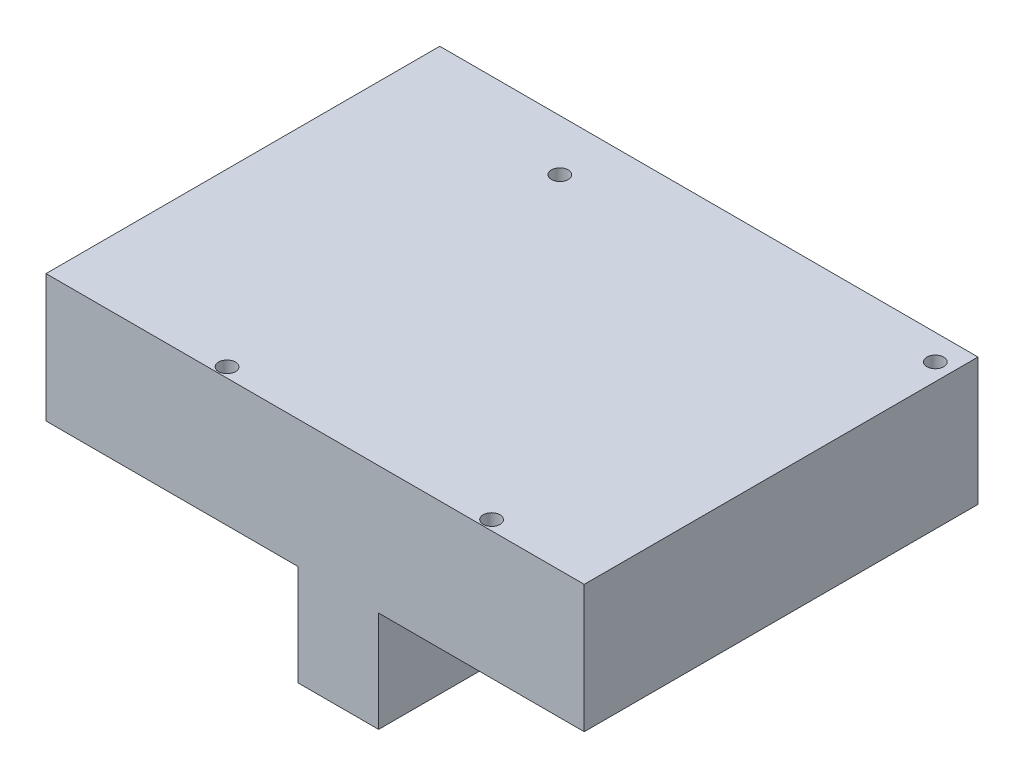
ISO-10303-21;
HEADER;
FILE_DESCRIPTION(('STEP AP214'),'2;1');
FILE_NAME('part.step','',(''),(''),'','','');
FILE_SCHEMA(('AUTOMOTIVE_DESIGN { 1 0 10303 214 1 1 1 1 }'));
ENDSEC;
DATA;
#1=APPLICATION_CONTEXT('core data for automotive mechanical design processes');
#2=APPLICATION_PROTOCOL_DEFINITION('international standard','automotive_design',2000,#1);
#3=PRODUCT_CONTEXT('',#1,'mechanical');
#4=PRODUCT('Part','Part','',(#3));
#5=PRODUCT_RELATED_PRODUCT_CATEGORY('part','',(#4));
#6=PRODUCT_DEFINITION_FORMATION('','',#4);
#7=PRODUCT_DEFINITION_CONTEXT('part definition',#1,'design');
#8=PRODUCT_DEFINITION('design','',#6,#7);
#9=PRODUCT_DEFINITION_SHAPE('','',#8);
#10=(LENGTH_UNIT() NAMED_UNIT(*) SI_UNIT(.MILLI.,.METRE.));
#11=(NAMED_UNIT(*) PLANE_ANGLE_UNIT() SI_UNIT($,.RADIAN.));
#12=(NAMED_UNIT(*) SI_UNIT($,.STERADIAN.) SOLID_ANGLE_UNIT());
#13=UNCERTAINTY_MEASURE_WITH_UNIT(LENGTH_MEASURE(1.E-05),#10,'distance_accuracy_value','');
#14=(GEOMETRIC_REPRESENTATION_CONTEXT(3) GLOBAL_UNCERTAINTY_ASSIGNED_CONTEXT((#13)) GLOBAL_UNIT_ASSIGNED_CONTEXT((#10,
#11,#12)) REPRESENTATION_CONTEXT('',''));
#15=CARTESIAN_POINT('',(0.,0.,0.));
#16=DIRECTION('',(0.,0.,1.));
#17=DIRECTION('',(1.,0.,0.));
#18=AXIS2_PLACEMENT_3D('',#15,#16,#17);
#19=CARTESIAN_POINT('',(0.,0.,0.));
#20=DIRECTION('',(0.,-1.,0.));
#21=DIRECTION('',(0.,0.,-1.));
#22=AXIS2_PLACEMENT_3D('',#19,#20,#21);
#23=PLANE('',#22);
#24=CARTESIAN_POINT('',(25.49,0.,-1.44999999999999));
#25=DIRECTION('',(0.,-1.,0.));
#26=DIRECTION('',(0.,0.,-1.));
#27=AXIS2_PLACEMENT_3D('',#24,#25,#26);
#28=CIRCLE('',#27,1.25000000000001);
#29=CARTESIAN_POINT('',(25.49,0.,-2.7));
#30=VERTEX_POINT('',#29);
#31=EDGE_CURVE('E168',#30,#30,#28,.T.);
#32=ORIENTED_EDGE('',*,*,#31,.F.);
#33=EDGE_LOOP('',(#32));
#34=FACE_BOUND('',#33,.T.);
#35=CARTESIAN_POINT('',(25.49,0.,-50.98));
#36=DIRECTION('',(0.,-1.,0.));
#37=DIRECTION('',(0.,0.,-1.));
#38=AXIS2_PLACEMENT_3D('',#35,#36,#37);
#39=CIRCLE('',#38,1.25000000000001);
#40=CARTESIAN_POINT('',(25.49,0.,-52.23));
#41=VERTEX_POINT('',#40);
#42=EDGE_CURVE('E162',#41,#41,#39,.T.);
#43=ORIENTED_EDGE('',*,*,#42,.F.);
#44=EDGE_LOOP('',(#43));
#45=FACE_BOUND('',#44,.T.);
#46=DIRECTION('',(0.,0.,-1.));
#47=VECTOR('',#46,1.);
#48=CARTESIAN_POINT('',(37.5,0.,-58.6));
#49=LINE('',#48,#47);
#50=CARTESIAN_POINT('',(37.5,0.,0.));
#51=VERTEX_POINT('',#50);
#52=CARTESIAN_POINT('',(37.5,0.,-58.6));
#53=VERTEX_POINT('',#52);
#54=EDGE_CURVE('E51',#51,#53,#49,.T.);
#55=ORIENTED_EDGE('',*,*,#54,.F.);
#56=DIRECTION('',(1.,0.,0.));
#57=VECTOR('',#56,1.);
#58=CARTESIAN_POINT('',(0.,0.,0.));
#59=LINE('',#58,#57);
#60=CARTESIAN_POINT('',(0.,0.,0.));
#61=VERTEX_POINT('',#60);
#62=EDGE_CURVE('E202',#61,#51,#59,.T.);
#63=ORIENTED_EDGE('',*,*,#62,.F.);
#64=DIRECTION('',(0.,0.,1.));
#65=VECTOR('',#64,1.);
#66=CARTESIAN_POINT('',(0.,0.,0.));
#67=LINE('',#66,#65);
#68=CARTESIAN_POINT('',(0.,0.,-58.6));
#69=VERTEX_POINT('',#68);
#70=EDGE_CURVE('E122',#69,#61,#67,.T.);
#71=ORIENTED_EDGE('',*,*,#70,.F.);
#72=DIRECTION('',(-1.,0.,0.));
#73=VECTOR('',#72,1.);
#74=CARTESIAN_POINT('',(0.,0.,-58.6));
#75=LINE('',#74,#73);
#76=EDGE_CURVE('E56',#53,#69,#75,.T.);
#77=ORIENTED_EDGE('',*,*,#76,.F.);
#78=EDGE_LOOP('',(#55,#63,#71,#77));
#79=FACE_BOUND('',#78,.T.);
#80=ADVANCED_FACE('F34',(#34,#45,#79),#23,.T.);
#81=CARTESIAN_POINT('',(0.,19.,0.));
#82=DIRECTION('',(1.,0.,0.));
#83=DIRECTION('',(0.,0.,-1.));
#84=AXIS2_PLACEMENT_3D('',#81,#82,#83);
#85=PLANE('',#84);
#86=ORIENTED_EDGE('',*,*,#70,.T.);
#87=DIRECTION('',(0.,-1.,0.));
#88=VECTOR('',#87,1.);
#89=CARTESIAN_POINT('',(0.,19.,0.));
#90=LINE('',#89,#88);
#91=CARTESIAN_POINT('',(0.,19.,0.));
#92=VERTEX_POINT('',#91);
#93=EDGE_CURVE('E11',#92,#61,#90,.T.);
#94=ORIENTED_EDGE('',*,*,#93,.F.);
#95=DIRECTION('',(0.,0.,1.));
#96=VECTOR('',#95,1.);
#97=CARTESIAN_POINT('',(0.,19.,0.));
#98=LINE('',#97,#96);
#99=CARTESIAN_POINT('',(0.,19.,-58.6));
#100=VERTEX_POINT('',#99);
#101=EDGE_CURVE('E145',#100,#92,#98,.T.);
#102=ORIENTED_EDGE('',*,*,#101,.F.);
#103=DIRECTION('',(0.,-1.,0.));
#104=VECTOR('',#103,1.);
#105=CARTESIAN_POINT('',(0.,19.,-58.6));
#106=LINE('',#105,#104);
#107=EDGE_CURVE('E213',#100,#69,#106,.T.);
#108=ORIENTED_EDGE('',*,*,#107,.T.);
#109=EDGE_LOOP('',(#86,#94,#102,#108));
#110=FACE_BOUND('',#109,.T.);
#111=ADVANCED_FACE('F36',(#110),#85,.F.);
#112=CARTESIAN_POINT('',(0.,19.,0.));
#113=DIRECTION('',(0.,0.,-1.));
#114=DIRECTION('',(-1.,0.,0.));
#115=AXIS2_PLACEMENT_3D('',#112,#113,#114);
#116=PLANE('',#115);
#117=ORIENTED_EDGE('',*,*,#62,.T.);
#118=DIRECTION('',(0.,1.,0.));
#119=VECTOR('',#118,1.);
#120=CARTESIAN_POINT('',(37.5,-15.,0.));
#121=LINE('',#120,#119);
#122=CARTESIAN_POINT('',(37.5,-15.,0.));
#123=VERTEX_POINT('',#122);
#124=EDGE_CURVE('E137',#123,#51,#121,.T.);
#125=ORIENTED_EDGE('',*,*,#124,.F.);
#126=DIRECTION('',(-1.,0.,0.));
#127=VECTOR('',#126,1.);
#128=CARTESIAN_POINT('',(37.5,-15.,0.));
#129=LINE('',#128,#127);
#130=CARTESIAN_POINT('',(49.5,-15.,0.));
#131=VERTEX_POINT('',#130);
#132=EDGE_CURVE('E115',#131,#123,#129,.T.);
#133=ORIENTED_EDGE('',*,*,#132,.F.);
#134=DIRECTION('',(0.,1.,0.));
#135=VECTOR('',#134,1.);
#136=CARTESIAN_POINT('',(49.5,-15.,0.));
#137=LINE('',#136,#135);
#138=CARTESIAN_POINT('',(49.5,0.,0.));
#139=VERTEX_POINT('',#138);
#140=EDGE_CURVE('E127',#131,#139,#137,.T.);
#141=ORIENTED_EDGE('',*,*,#140,.T.);
#142=CARTESIAN_POINT('',(80.1,0.,0.));
#143=VERTEX_POINT('',#142);
#144=EDGE_CURVE('E125',#139,#143,#59,.T.);
#145=ORIENTED_EDGE('',*,*,#144,.T.);
#146=DIRECTION('',(0.,-1.,0.));
#147=VECTOR('',#146,1.);
#148=CARTESIAN_POINT('',(80.1,19.,0.));
#149=LINE('',#148,#147);
#150=CARTESIAN_POINT('',(80.1,19.,0.));
#151=VERTEX_POINT('',#150);
#152=EDGE_CURVE('E43',#151,#143,#149,.T.);
#153=ORIENTED_EDGE('',*,*,#152,.F.);
#154=DIRECTION('',(1.,0.,0.));
#155=VECTOR('',#154,1.);
#156=CARTESIAN_POINT('',(0.,19.,0.));
#157=LINE('',#156,#155);
#158=EDGE_CURVE('E226',#92,#151,#157,.T.);
#159=ORIENTED_EDGE('',*,*,#158,.F.);
#160=ORIENTED_EDGE('',*,*,#93,.T.);
#161=EDGE_LOOP('',(#117,#125,#133,#141,#145,#153,#159,#160));
#162=FACE_BOUND('',#161,.T.);
#163=ADVANCED_FACE('F201',(#162),#116,.F.);
#164=CARTESIAN_POINT('',(80.1,19.,0.));
#165=DIRECTION('',(-1.,0.,0.));
#166=DIRECTION('',(0.,0.,1.));
#167=AXIS2_PLACEMENT_3D('',#164,#165,#166);
#168=PLANE('',#167);
#169=DIRECTION('',(0.,0.,-1.));
#170=VECTOR('',#169,1.);
#171=CARTESIAN_POINT('',(80.1,0.,0.));
#172=LINE('',#171,#170);
#173=CARTESIAN_POINT('',(80.1,0.,-58.6));
#174=VERTEX_POINT('',#173);
#175=EDGE_CURVE('E204',#143,#174,#172,.T.);
#176=ORIENTED_EDGE('',*,*,#175,.T.);
#177=DIRECTION('',(0.,-1.,0.));
#178=VECTOR('',#177,1.);
#179=CARTESIAN_POINT('',(80.1,19.,-58.6));
#180=LINE('',#179,#178);
#181=CARTESIAN_POINT('',(80.1,19.,-58.6));
#182=VERTEX_POINT('',#181);
#183=EDGE_CURVE('E198',#182,#174,#180,.T.);
#184=ORIENTED_EDGE('',*,*,#183,.F.);
#185=DIRECTION('',(0.,0.,-1.));
#186=VECTOR('',#185,1.);
#187=CARTESIAN_POINT('',(80.1,19.,0.));
#188=LINE('',#187,#186);
#189=EDGE_CURVE('E223',#151,#182,#188,.T.);
#190=ORIENTED_EDGE('',*,*,#189,.F.);
#191=ORIENTED_EDGE('',*,*,#152,.T.);
#192=EDGE_LOOP('',(#176,#184,#190,#191));
#193=FACE_BOUND('',#192,.T.);
#194=ADVANCED_FACE('F241',(#193),#168,.F.);
#195=CARTESIAN_POINT('',(0.,19.,-58.6));
#196=DIRECTION('',(0.,0.,1.));
#197=DIRECTION('',(1.,0.,0.));
#198=AXIS2_PLACEMENT_3D('',#195,#196,#197);
#199=PLANE('',#198);
#200=CARTESIAN_POINT('',(49.5,0.,-58.6));
#201=VERTEX_POINT('',#200);
#202=EDGE_CURVE('E193',#174,#201,#75,.T.);
#203=ORIENTED_EDGE('',*,*,#202,.T.);
#204=DIRECTION('',(0.,1.,0.));
#205=VECTOR('',#204,1.);
#206=CARTESIAN_POINT('',(49.5,-15.,-58.6));
#207=LINE('',#206,#205);
#208=CARTESIAN_POINT('',(49.5,-15.,-58.6));
#209=VERTEX_POINT('',#208);
#210=EDGE_CURVE('E106',#209,#201,#207,.T.);
#211=ORIENTED_EDGE('',*,*,#210,.F.);
#212=DIRECTION('',(1.,0.,0.));
#213=VECTOR('',#212,1.);
#214=CARTESIAN_POINT('',(37.5,-15.,-58.6));
#215=LINE('',#214,#213);
#216=CARTESIAN_POINT('',(37.5,-15.,-58.6));
#217=VERTEX_POINT('',#216);
#218=EDGE_CURVE('E99',#217,#209,#215,.T.);
#219=ORIENTED_EDGE('',*,*,#218,.F.);
#220=DIRECTION('',(0.,1.,0.));
#221=VECTOR('',#220,1.);
#222=CARTESIAN_POINT('',(37.5,-15.,-58.6));
#223=LINE('',#222,#221);
#224=EDGE_CURVE('E104',#217,#53,#223,.T.);
#225=ORIENTED_EDGE('',*,*,#224,.T.);
#226=ORIENTED_EDGE('',*,*,#76,.T.);
#227=ORIENTED_EDGE('',*,*,#107,.F.);
#228=DIRECTION('',(-1.,0.,0.));
#229=VECTOR('',#228,1.);
#230=CARTESIAN_POINT('',(0.,19.,-58.6));
#231=LINE('',#230,#229);
#232=EDGE_CURVE('E219',#182,#100,#231,.T.);
#233=ORIENTED_EDGE('',*,*,#232,.F.);
#234=ORIENTED_EDGE('',*,*,#183,.T.);
#235=EDGE_LOOP('',(#203,#211,#219,#225,#226,#227,#233,#234));
#236=FACE_BOUND('',#235,.T.);
#237=ADVANCED_FACE('F102',(#236),#199,.F.);
#238=CARTESIAN_POINT('',(0.,19.,0.));
#239=DIRECTION('',(0.,-1.,0.));
#240=DIRECTION('',(0.,0.,-1.));
#241=AXIS2_PLACEMENT_3D('',#238,#239,#240);
#242=PLANE('',#241);
#243=CARTESIAN_POINT('',(64.86,19.,-1.44999999999999));
#244=DIRECTION('',(0.,1.,0.));
#245=DIRECTION('',(0.,0.,1.));
#246=AXIS2_PLACEMENT_3D('',#243,#244,#245);
#247=CIRCLE('',#246,1.25);
#248=CARTESIAN_POINT('',(64.86,19.,-0.199999999999988));
#249=VERTEX_POINT('',#248);
#250=EDGE_CURVE('E174',#249,#249,#247,.T.);
#251=ORIENTED_EDGE('',*,*,#250,.F.);
#252=EDGE_LOOP('',(#251));
#253=FACE_BOUND('',#252,.T.);
#254=CARTESIAN_POINT('',(25.49,19.,-1.44999999999999));
#255=DIRECTION('',(0.,1.,0.));
#256=DIRECTION('',(0.,0.,1.));
#257=AXIS2_PLACEMENT_3D('',#254,#255,#256);
#258=CIRCLE('',#257,1.25000000000001);
#259=CARTESIAN_POINT('',(25.49,19.,-0.199999999999974));
#260=VERTEX_POINT('',#259);
#261=EDGE_CURVE('E171',#260,#260,#258,.T.);
#262=ORIENTED_EDGE('',*,*,#261,.F.);
#263=EDGE_LOOP('',(#262));
#264=FACE_BOUND('',#263,.T.);
#265=CARTESIAN_POINT('',(25.49,19.,-50.98));
#266=DIRECTION('',(0.,1.,0.));
#267=DIRECTION('',(0.,0.,1.));
#268=AXIS2_PLACEMENT_3D('',#265,#266,#267);
#269=CIRCLE('',#268,1.25000000000001);
#270=CARTESIAN_POINT('',(25.49,19.,-49.73));
#271=VERTEX_POINT('',#270);
#272=EDGE_CURVE('E165',#271,#271,#269,.T.);
#273=ORIENTED_EDGE('',*,*,#272,.F.);
#274=EDGE_LOOP('',(#273));
#275=FACE_BOUND('',#274,.T.);
#276=CARTESIAN_POINT('',(77.56,19.,-54.79));
#277=DIRECTION('',(0.,1.,0.));
#278=DIRECTION('',(0.,0.,1.));
#279=AXIS2_PLACEMENT_3D('',#276,#277,#278);
#280=CIRCLE('',#279,1.25);
#281=CARTESIAN_POINT('',(77.56,19.,-53.54));
#282=VERTEX_POINT('',#281);
#283=EDGE_CURVE('E159',#282,#282,#280,.T.);
#284=ORIENTED_EDGE('',*,*,#283,.F.);
#285=EDGE_LOOP('',(#284));
#286=FACE_BOUND('',#285,.T.);
#287=ORIENTED_EDGE('',*,*,#101,.T.);
#288=ORIENTED_EDGE('',*,*,#158,.T.);
#289=ORIENTED_EDGE('',*,*,#189,.T.);
#290=ORIENTED_EDGE('',*,*,#232,.T.);
#291=EDGE_LOOP('',(#287,#288,#289,#290));
#292=FACE_BOUND('',#291,.T.);
#293=ADVANCED_FACE('F186',(#253,#264,#275,#286,#292),#242,.F.);
#294=CARTESIAN_POINT('',(64.86,0.,-1.44999999999999));
#295=DIRECTION('',(0.,-1.,0.));
#296=DIRECTION('',(0.,0.,-1.));
#297=AXIS2_PLACEMENT_3D('',#294,#295,#296);
#298=CIRCLE('',#297,1.25);
#299=CARTESIAN_POINT('',(64.86,0.,-2.69999999999998));
#300=VERTEX_POINT('',#299);
#301=EDGE_CURVE('E38',#300,#300,#298,.T.);
#302=ORIENTED_EDGE('',*,*,#301,.F.);
#303=EDGE_LOOP('',(#302));
#304=FACE_BOUND('',#303,.T.);
#305=CARTESIAN_POINT('',(77.56,0.,-54.79));
#306=DIRECTION('',(0.,-1.,0.));
#307=DIRECTION('',(0.,0.,-1.));
#308=AXIS2_PLACEMENT_3D('',#305,#306,#307);
#309=CIRCLE('',#308,1.25);
#310=CARTESIAN_POINT('',(77.56,0.,-56.04));
#311=VERTEX_POINT('',#310);
#312=EDGE_CURVE('E136',#311,#311,#309,.T.);
#313=ORIENTED_EDGE('',*,*,#312,.F.);
#314=EDGE_LOOP('',(#313));
#315=FACE_BOUND('',#314,.T.);
#316=DIRECTION('',(0.,0.,1.));
#317=VECTOR('',#316,1.);
#318=CARTESIAN_POINT('',(49.5,0.,-58.6));
#319=LINE('',#318,#317);
#320=EDGE_CURVE('E119',#201,#139,#319,.T.);
#321=ORIENTED_EDGE('',*,*,#320,.F.);
#322=ORIENTED_EDGE('',*,*,#202,.F.);
#323=ORIENTED_EDGE('',*,*,#175,.F.);
#324=ORIENTED_EDGE('',*,*,#144,.F.);
#325=EDGE_LOOP('',(#321,#322,#323,#324));
#326=FACE_BOUND('',#325,.T.);
#327=ADVANCED_FACE('F183',(#304,#315,#326),#23,.T.);
#328=CARTESIAN_POINT('',(37.5,-15.,-58.6));
#329=DIRECTION('',(1.,0.,0.));
#330=DIRECTION('',(0.,0.,-1.));
#331=AXIS2_PLACEMENT_3D('',#328,#329,#330);
#332=PLANE('',#331);
#333=ORIENTED_EDGE('',*,*,#54,.T.);
#334=ORIENTED_EDGE('',*,*,#224,.F.);
#335=DIRECTION('',(0.,0.,-1.));
#336=VECTOR('',#335,1.);
#337=CARTESIAN_POINT('',(37.5,-15.,-58.6));
#338=LINE('',#337,#336);
#339=EDGE_CURVE('E110',#123,#217,#338,.T.);
#340=ORIENTED_EDGE('',*,*,#339,.F.);
#341=ORIENTED_EDGE('',*,*,#124,.T.);
#342=EDGE_LOOP('',(#333,#334,#340,#341));
#343=FACE_BOUND('',#342,.T.);
#344=ADVANCED_FACE('F121',(#343),#332,.F.);
#345=CARTESIAN_POINT('',(49.5,-15.,-58.6));
#346=DIRECTION('',(-1.,0.,0.));
#347=DIRECTION('',(0.,0.,1.));
#348=AXIS2_PLACEMENT_3D('',#345,#346,#347);
#349=PLANE('',#348);
#350=ORIENTED_EDGE('',*,*,#320,.T.);
#351=ORIENTED_EDGE('',*,*,#140,.F.);
#352=DIRECTION('',(0.,0.,1.));
#353=VECTOR('',#352,1.);
#354=CARTESIAN_POINT('',(49.5,-15.,-58.6));
#355=LINE('',#354,#353);
#356=EDGE_CURVE('E109',#209,#131,#355,.T.);
#357=ORIENTED_EDGE('',*,*,#356,.F.);
#358=ORIENTED_EDGE('',*,*,#210,.T.);
#359=EDGE_LOOP('',(#350,#351,#357,#358));
#360=FACE_BOUND('',#359,.T.);
#361=ADVANCED_FACE('F200',(#360),#349,.F.);
#362=CARTESIAN_POINT('',(0.,-15.,0.));
#363=DIRECTION('',(0.,1.,0.));
#364=DIRECTION('',(0.,0.,1.));
#365=AXIS2_PLACEMENT_3D('',#362,#363,#364);
#366=PLANE('',#365);
#367=ORIENTED_EDGE('',*,*,#339,.T.);
#368=ORIENTED_EDGE('',*,*,#218,.T.);
#369=ORIENTED_EDGE('',*,*,#356,.T.);
#370=ORIENTED_EDGE('',*,*,#132,.T.);
#371=EDGE_LOOP('',(#367,#368,#369,#370));
#372=FACE_BOUND('',#371,.T.);
#373=ADVANCED_FACE('F113',(#372),#366,.F.);
#374=CARTESIAN_POINT('',(77.56,-15.000025,-54.79));
#375=DIRECTION('',(0.,1.,0.));
#376=DIRECTION('',(0.,0.,1.));
#377=AXIS2_PLACEMENT_3D('',#374,#375,#376);
#378=CYLINDRICAL_SURFACE('',#377,1.25);
#379=ORIENTED_EDGE('',*,*,#312,.T.);
#380=EDGE_LOOP('',(#379));
#381=FACE_BOUND('',#380,.T.);
#382=ORIENTED_EDGE('',*,*,#283,.T.);
#383=EDGE_LOOP('',(#382));
#384=FACE_BOUND('',#383,.T.);
#385=ADVANCED_FACE('F285',(#381,#384),#378,.F.);
#386=CARTESIAN_POINT('',(25.49,-15.000025,-50.98));
#387=DIRECTION('',(0.,1.,0.));
#388=DIRECTION('',(0.,0.,1.));
#389=AXIS2_PLACEMENT_3D('',#386,#387,#388);
#390=CYLINDRICAL_SURFACE('',#389,1.25000000000001);
#391=ORIENTED_EDGE('',*,*,#42,.T.);
#392=EDGE_LOOP('',(#391));
#393=FACE_BOUND('',#392,.T.);
#394=ORIENTED_EDGE('',*,*,#272,.T.);
#395=EDGE_LOOP('',(#394));
#396=FACE_BOUND('',#395,.T.);
#397=ADVANCED_FACE('F291',(#393,#396),#390,.F.);
#398=CARTESIAN_POINT('',(25.49,-15.000025,-1.44999999999999));
#399=DIRECTION('',(0.,1.,0.));
#400=DIRECTION('',(0.,0.,1.));
#401=AXIS2_PLACEMENT_3D('',#398,#399,#400);
#402=CYLINDRICAL_SURFACE('',#401,1.25000000000001);
#403=ORIENTED_EDGE('',*,*,#31,.T.);
#404=EDGE_LOOP('',(#403));
#405=FACE_BOUND('',#404,.T.);
#406=ORIENTED_EDGE('',*,*,#261,.T.);
#407=EDGE_LOOP('',(#406));
#408=FACE_BOUND('',#407,.T.);
#409=ADVANCED_FACE('F299',(#405,#408),#402,.F.);
#410=CARTESIAN_POINT('',(64.86,-15.000025,-1.44999999999999));
#411=DIRECTION('',(0.,1.,0.));
#412=DIRECTION('',(0.,0.,1.));
#413=AXIS2_PLACEMENT_3D('',#410,#411,#412);
#414=CYLINDRICAL_SURFACE('',#413,1.25);
#415=ORIENTED_EDGE('',*,*,#301,.T.);
#416=EDGE_LOOP('',(#415));
#417=FACE_BOUND('',#416,.T.);
#418=ORIENTED_EDGE('',*,*,#250,.T.);
#419=EDGE_LOOP('',(#418));
#420=FACE_BOUND('',#419,.T.);
#421=ADVANCED_FACE('F181',(#417,#420),#414,.F.);
#422=CLOSED_SHELL('',(#80,#111,#163,#194,#237,#293,#327,#344,#361,#373,#385,#397,#409,#421));
#423=MANIFOLD_SOLID_BREP('B2',#422);
#424=ADVANCED_BREP_SHAPE_REPRESENTATION('',(#18,#423),#14);
#425=SHAPE_DEFINITION_REPRESENTATION(#9,#424);
ENDSEC;
END-ISO-10303-21;
